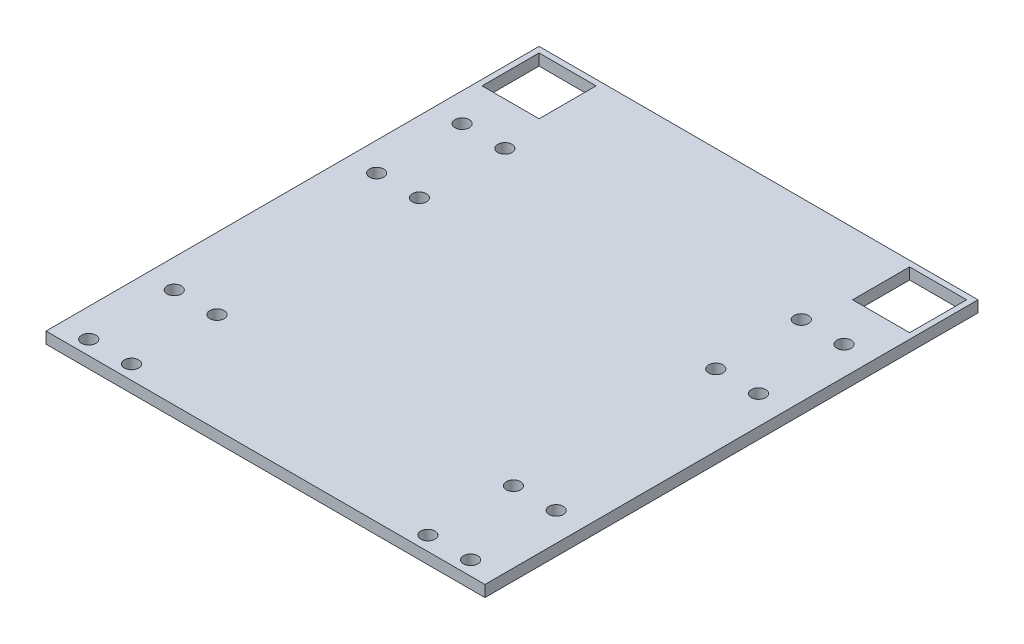
ISO-10303-21;
HEADER;
FILE_DESCRIPTION(('STEP AP214'),'2;1');
FILE_NAME('part.step','',(''),(''),'','','');
FILE_SCHEMA(('AUTOMOTIVE_DESIGN { 1 0 10303 214 1 1 1 1 }'));
ENDSEC;
DATA;
#1=APPLICATION_CONTEXT('core data for automotive mechanical design processes');
#2=APPLICATION_PROTOCOL_DEFINITION('international standard','automotive_design',2000,#1);
#3=PRODUCT_CONTEXT('',#1,'mechanical');
#4=PRODUCT('Part','Part','',(#3));
#5=PRODUCT_RELATED_PRODUCT_CATEGORY('part','',(#4));
#6=PRODUCT_DEFINITION_FORMATION('','',#4);
#7=PRODUCT_DEFINITION_CONTEXT('part definition',#1,'design');
#8=PRODUCT_DEFINITION('design','',#6,#7);
#9=PRODUCT_DEFINITION_SHAPE('','',#8);
#10=(LENGTH_UNIT() NAMED_UNIT(*) SI_UNIT(.MILLI.,.METRE.));
#11=(NAMED_UNIT(*) PLANE_ANGLE_UNIT() SI_UNIT($,.RADIAN.));
#12=(NAMED_UNIT(*) SI_UNIT($,.STERADIAN.) SOLID_ANGLE_UNIT());
#13=UNCERTAINTY_MEASURE_WITH_UNIT(LENGTH_MEASURE(1.E-05),#10,'distance_accuracy_value','');
#14=(GEOMETRIC_REPRESENTATION_CONTEXT(3) GLOBAL_UNCERTAINTY_ASSIGNED_CONTEXT((#13)) GLOBAL_UNIT_ASSIGNED_CONTEXT((#10,
#11,#12)) REPRESENTATION_CONTEXT('',''));
#15=CARTESIAN_POINT('',(0.,0.,0.));
#16=DIRECTION('',(0.,0.,1.));
#17=DIRECTION('',(1.,0.,0.));
#18=AXIS2_PLACEMENT_3D('',#15,#16,#17);
#19=CARTESIAN_POINT('',(0.,4.,0.));
#20=DIRECTION('',(-1.,0.,0.));
#21=DIRECTION('',(0.,0.,1.));
#22=AXIS2_PLACEMENT_3D('',#19,#20,#21);
#23=PLANE('',#22);
#24=DIRECTION('',(0.,0.,-1.));
#25=VECTOR('',#24,1.);
#26=CARTESIAN_POINT('',(0.,0.,0.));
#27=LINE('',#26,#25);
#28=CARTESIAN_POINT('',(0.,0.,173.));
#29=VERTEX_POINT('',#28);
#30=CARTESIAN_POINT('',(0.,0.,0.));
#31=VERTEX_POINT('',#30);
#32=EDGE_CURVE('E225',#29,#31,#27,.T.);
#33=ORIENTED_EDGE('',*,*,#32,.T.);
#34=DIRECTION('',(0.,-1.,0.));
#35=VECTOR('',#34,1.);
#36=CARTESIAN_POINT('',(0.,4.,0.));
#37=LINE('',#36,#35);
#38=CARTESIAN_POINT('',(0.,4.,0.));
#39=VERTEX_POINT('',#38);
#40=EDGE_CURVE('E11',#39,#31,#37,.T.);
#41=ORIENTED_EDGE('',*,*,#40,.F.);
#42=DIRECTION('',(0.,0.,-1.));
#43=VECTOR('',#42,1.);
#44=CARTESIAN_POINT('',(0.,4.,0.));
#45=LINE('',#44,#43);
#46=CARTESIAN_POINT('',(0.,4.,173.));
#47=VERTEX_POINT('',#46);
#48=EDGE_CURVE('E234',#47,#39,#45,.T.);
#49=ORIENTED_EDGE('',*,*,#48,.F.);
#50=DIRECTION('',(0.,-1.,0.));
#51=VECTOR('',#50,1.);
#52=CARTESIAN_POINT('',(0.,4.,173.));
#53=LINE('',#52,#51);
#54=EDGE_CURVE('E248',#47,#29,#53,.T.);
#55=ORIENTED_EDGE('',*,*,#54,.T.);
#56=EDGE_LOOP('',(#33,#41,#49,#55));
#57=FACE_BOUND('',#56,.T.);
#58=ADVANCED_FACE('F39',(#57),#23,.F.);
#59=CARTESIAN_POINT('',(0.,4.,0.));
#60=DIRECTION('',(0.,0.,1.));
#61=DIRECTION('',(1.,0.,0.));
#62=AXIS2_PLACEMENT_3D('',#59,#60,#61);
#63=PLANE('',#62);
#64=DIRECTION('',(-1.,0.,0.));
#65=VECTOR('',#64,1.);
#66=CARTESIAN_POINT('',(0.,0.,0.));
#67=LINE('',#66,#65);
#68=CARTESIAN_POINT('',(-154.,0.,0.));
#69=VERTEX_POINT('',#68);
#70=EDGE_CURVE('E252',#31,#69,#67,.T.);
#71=ORIENTED_EDGE('',*,*,#70,.T.);
#72=DIRECTION('',(0.,-1.,0.));
#73=VECTOR('',#72,1.);
#74=CARTESIAN_POINT('',(-154.,4.,0.));
#75=LINE('',#74,#73);
#76=CARTESIAN_POINT('',(-154.,4.,0.));
#77=VERTEX_POINT('',#76);
#78=EDGE_CURVE('E47',#77,#69,#75,.T.);
#79=ORIENTED_EDGE('',*,*,#78,.F.);
#80=DIRECTION('',(-1.,0.,0.));
#81=VECTOR('',#80,1.);
#82=CARTESIAN_POINT('',(0.,4.,0.));
#83=LINE('',#82,#81);
#84=EDGE_CURVE('E238',#39,#77,#83,.T.);
#85=ORIENTED_EDGE('',*,*,#84,.F.);
#86=ORIENTED_EDGE('',*,*,#40,.T.);
#87=EDGE_LOOP('',(#71,#79,#85,#86));
#88=FACE_BOUND('',#87,.T.);
#89=ADVANCED_FACE('F287',(#88),#63,.F.);
#90=CARTESIAN_POINT('',(-154.,4.,0.));
#91=DIRECTION('',(1.,0.,0.));
#92=DIRECTION('',(0.,0.,-1.));
#93=AXIS2_PLACEMENT_3D('',#90,#91,#92);
#94=PLANE('',#93);
#95=DIRECTION('',(0.,0.,1.));
#96=VECTOR('',#95,1.);
#97=CARTESIAN_POINT('',(-154.,0.,0.));
#98=LINE('',#97,#96);
#99=CARTESIAN_POINT('',(-154.,0.,173.));
#100=VERTEX_POINT('',#99);
#101=EDGE_CURVE('E255',#69,#100,#98,.T.);
#102=ORIENTED_EDGE('',*,*,#101,.T.);
#103=DIRECTION('',(0.,-1.,0.));
#104=VECTOR('',#103,1.);
#105=CARTESIAN_POINT('',(-154.,4.,173.));
#106=LINE('',#105,#104);
#107=CARTESIAN_POINT('',(-154.,4.,173.));
#108=VERTEX_POINT('',#107);
#109=EDGE_CURVE('E263',#108,#100,#106,.T.);
#110=ORIENTED_EDGE('',*,*,#109,.F.);
#111=DIRECTION('',(0.,0.,1.));
#112=VECTOR('',#111,1.);
#113=CARTESIAN_POINT('',(-154.,4.,0.));
#114=LINE('',#113,#112);
#115=EDGE_CURVE('E242',#77,#108,#114,.T.);
#116=ORIENTED_EDGE('',*,*,#115,.F.);
#117=ORIENTED_EDGE('',*,*,#78,.T.);
#118=EDGE_LOOP('',(#102,#110,#116,#117));
#119=FACE_BOUND('',#118,.T.);
#120=ADVANCED_FACE('F272',(#119),#94,.F.);
#121=CARTESIAN_POINT('',(0.,4.,173.));
#122=DIRECTION('',(0.,0.,-1.));
#123=DIRECTION('',(-1.,0.,0.));
#124=AXIS2_PLACEMENT_3D('',#121,#122,#123);
#125=PLANE('',#124);
#126=DIRECTION('',(1.,0.,0.));
#127=VECTOR('',#126,1.);
#128=CARTESIAN_POINT('',(0.,0.,173.));
#129=LINE('',#128,#127);
#130=EDGE_CURVE('E239',#100,#29,#129,.T.);
#131=ORIENTED_EDGE('',*,*,#130,.T.);
#132=ORIENTED_EDGE('',*,*,#54,.F.);
#133=DIRECTION('',(1.,0.,0.));
#134=VECTOR('',#133,1.);
#135=CARTESIAN_POINT('',(0.,4.,173.));
#136=LINE('',#135,#134);
#137=EDGE_CURVE('E245',#108,#47,#136,.T.);
#138=ORIENTED_EDGE('',*,*,#137,.F.);
#139=ORIENTED_EDGE('',*,*,#109,.T.);
#140=EDGE_LOOP('',(#131,#132,#138,#139));
#141=FACE_BOUND('',#140,.T.);
#142=ADVANCED_FACE('F280',(#141),#125,.F.);
#143=CARTESIAN_POINT('',(0.,4.,0.));
#144=DIRECTION('',(0.,-1.,0.));
#145=DIRECTION('',(0.,0.,-1.));
#146=AXIS2_PLACEMENT_3D('',#143,#144,#145);
#147=PLANE('',#146);
#148=CARTESIAN_POINT('',(-10.,4.,138.));
#149=DIRECTION('',(0.,1.,0.));
#150=DIRECTION('',(0.,0.,1.));
#151=AXIS2_PLACEMENT_3D('',#148,#149,#150);
#152=CIRCLE('',#151,2.5);
#153=CARTESIAN_POINT('',(-10.,4.,140.5));
#154=VERTEX_POINT('',#153);
#155=EDGE_CURVE('E429',#154,#154,#152,.T.);
#156=ORIENTED_EDGE('',*,*,#155,.F.);
#157=EDGE_LOOP('',(#156));
#158=FACE_BOUND('',#157,.T.);
#159=CARTESIAN_POINT('',(-25.,4.,168.));
#160=DIRECTION('',(0.,1.,0.));
#161=DIRECTION('',(0.,0.,1.));
#162=AXIS2_PLACEMENT_3D('',#159,#160,#161);
#163=CIRCLE('',#162,2.5);
#164=CARTESIAN_POINT('',(-25.,4.,170.5));
#165=VERTEX_POINT('',#164);
#166=EDGE_CURVE('E446',#165,#165,#163,.T.);
#167=ORIENTED_EDGE('',*,*,#166,.F.);
#168=EDGE_LOOP('',(#167));
#169=FACE_BOUND('',#168,.T.);
#170=CARTESIAN_POINT('',(-10.,4.,168.));
#171=DIRECTION('',(0.,1.,0.));
#172=DIRECTION('',(0.,0.,1.));
#173=AXIS2_PLACEMENT_3D('',#170,#171,#172);
#174=CIRCLE('',#173,2.5);
#175=CARTESIAN_POINT('',(-10.,4.,170.5));
#176=VERTEX_POINT('',#175);
#177=EDGE_CURVE('E445',#176,#176,#174,.T.);
#178=ORIENTED_EDGE('',*,*,#177,.F.);
#179=EDGE_LOOP('',(#178));
#180=FACE_BOUND('',#179,.T.);
#181=CARTESIAN_POINT('',(-10.,4.,37.));
#182=DIRECTION('',(0.,1.,0.));
#183=DIRECTION('',(0.,0.,-1.));
#184=AXIS2_PLACEMENT_3D('',#181,#182,#183);
#185=CIRCLE('',#184,2.5);
#186=CARTESIAN_POINT('',(-10.,4.,34.5));
#187=VERTEX_POINT('',#186);
#188=EDGE_CURVE('E462',#187,#187,#185,.T.);
#189=ORIENTED_EDGE('',*,*,#188,.F.);
#190=EDGE_LOOP('',(#189));
#191=FACE_BOUND('',#190,.T.);
#192=CARTESIAN_POINT('',(-129.,4.,168.));
#193=DIRECTION('',(0.,1.,0.));
#194=DIRECTION('',(0.,0.,-1.));
#195=AXIS2_PLACEMENT_3D('',#192,#193,#194);
#196=CIRCLE('',#195,2.5);
#197=CARTESIAN_POINT('',(-129.,4.,165.5));
#198=VERTEX_POINT('',#197);
#199=EDGE_CURVE('E406',#198,#198,#196,.T.);
#200=ORIENTED_EDGE('',*,*,#199,.F.);
#201=EDGE_LOOP('',(#200));
#202=FACE_BOUND('',#201,.T.);
#203=CARTESIAN_POINT('',(-144.,4.,138.));
#204=DIRECTION('',(0.,1.,0.));
#205=DIRECTION('',(0.,0.,-1.));
#206=AXIS2_PLACEMENT_3D('',#203,#204,#205);
#207=CIRCLE('',#206,2.5);
#208=CARTESIAN_POINT('',(-144.,4.,135.5));
#209=VERTEX_POINT('',#208);
#210=EDGE_CURVE('E414',#209,#209,#207,.T.);
#211=ORIENTED_EDGE('',*,*,#210,.F.);
#212=EDGE_LOOP('',(#211));
#213=FACE_BOUND('',#212,.T.);
#214=CARTESIAN_POINT('',(-129.,4.,138.));
#215=DIRECTION('',(0.,1.,0.));
#216=DIRECTION('',(0.,0.,-1.));
#217=AXIS2_PLACEMENT_3D('',#214,#215,#216);
#218=CIRCLE('',#217,2.49999999999997);
#219=CARTESIAN_POINT('',(-129.,4.,135.5));
#220=VERTEX_POINT('',#219);
#221=EDGE_CURVE('E413',#220,#220,#218,.T.);
#222=ORIENTED_EDGE('',*,*,#221,.F.);
#223=EDGE_LOOP('',(#222));
#224=FACE_BOUND('',#223,.T.);
#225=CARTESIAN_POINT('',(-25.,4.,138.));
#226=DIRECTION('',(0.,1.,0.));
#227=DIRECTION('',(0.,0.,1.));
#228=AXIS2_PLACEMENT_3D('',#225,#226,#227);
#229=CIRCLE('',#228,2.5);
#230=CARTESIAN_POINT('',(-25.,4.,140.5));
#231=VERTEX_POINT('',#230);
#232=EDGE_CURVE('E430',#231,#231,#229,.T.);
#233=ORIENTED_EDGE('',*,*,#232,.F.);
#234=EDGE_LOOP('',(#233));
#235=FACE_BOUND('',#234,.T.);
#236=CARTESIAN_POINT('',(-144.,4.,67.));
#237=DIRECTION('',(0.,1.,0.));
#238=DIRECTION('',(0.,0.,1.));
#239=AXIS2_PLACEMENT_3D('',#236,#237,#238);
#240=CIRCLE('',#239,2.5);
#241=CARTESIAN_POINT('',(-144.,4.,69.5));
#242=VERTEX_POINT('',#241);
#243=EDGE_CURVE('E159',#242,#242,#240,.T.);
#244=ORIENTED_EDGE('',*,*,#243,.F.);
#245=EDGE_LOOP('',(#244));
#246=FACE_BOUND('',#245,.T.);
#247=CARTESIAN_POINT('',(-129.,4.,37.));
#248=DIRECTION('',(0.,1.,0.));
#249=DIRECTION('',(0.,0.,1.));
#250=AXIS2_PLACEMENT_3D('',#247,#248,#249);
#251=CIRCLE('',#250,2.5);
#252=CARTESIAN_POINT('',(-129.,4.,39.5));
#253=VERTEX_POINT('',#252);
#254=EDGE_CURVE('E507',#253,#253,#251,.T.);
#255=ORIENTED_EDGE('',*,*,#254,.F.);
#256=EDGE_LOOP('',(#255));
#257=FACE_BOUND('',#256,.T.);
#258=CARTESIAN_POINT('',(-144.,4.,37.));
#259=DIRECTION('',(0.,1.,0.));
#260=DIRECTION('',(0.,0.,1.));
#261=AXIS2_PLACEMENT_3D('',#258,#259,#260);
#262=CIRCLE('',#261,2.5);
#263=CARTESIAN_POINT('',(-144.,4.,39.5));
#264=VERTEX_POINT('',#263);
#265=EDGE_CURVE('E186',#264,#264,#262,.T.);
#266=ORIENTED_EDGE('',*,*,#265,.F.);
#267=EDGE_LOOP('',(#266));
#268=FACE_BOUND('',#267,.T.);
#269=DIRECTION('',(0.,0.,1.));
#270=VECTOR('',#269,1.);
#271=CARTESIAN_POINT('',(-22.,4.,2.));
#272=LINE('',#271,#270);
#273=CARTESIAN_POINT('',(-22.,4.,2.));
#274=VERTEX_POINT('',#273);
#275=CARTESIAN_POINT('',(-22.,4.,22.));
#276=VERTEX_POINT('',#275);
#277=EDGE_CURVE('E168',#274,#276,#272,.T.);
#278=ORIENTED_EDGE('',*,*,#277,.F.);
#279=DIRECTION('',(-1.,0.,0.));
#280=VECTOR('',#279,1.);
#281=CARTESIAN_POINT('',(-2.,4.,2.00000000000003));
#282=LINE('',#281,#280);
#283=CARTESIAN_POINT('',(-2.,4.,2.00000000000003));
#284=VERTEX_POINT('',#283);
#285=EDGE_CURVE('E54',#284,#274,#282,.T.);
#286=ORIENTED_EDGE('',*,*,#285,.F.);
#287=DIRECTION('',(0.,0.,-1.));
#288=VECTOR('',#287,1.);
#289=CARTESIAN_POINT('',(-2.,4.,2.00000000000003));
#290=LINE('',#289,#288);
#291=CARTESIAN_POINT('',(-2.,4.,22.));
#292=VERTEX_POINT('',#291);
#293=EDGE_CURVE('E152',#292,#284,#290,.T.);
#294=ORIENTED_EDGE('',*,*,#293,.F.);
#295=DIRECTION('',(1.,0.,0.));
#296=VECTOR('',#295,1.);
#297=CARTESIAN_POINT('',(-2.,4.,22.));
#298=LINE('',#297,#296);
#299=EDGE_CURVE('E156',#276,#292,#298,.T.);
#300=ORIENTED_EDGE('',*,*,#299,.F.);
#301=EDGE_LOOP('',(#278,#286,#294,#300));
#302=FACE_BOUND('',#301,.T.);
#303=CARTESIAN_POINT('',(-25.,4.,37.));
#304=DIRECTION('',(0.,1.,0.));
#305=DIRECTION('',(0.,0.,-1.));
#306=AXIS2_PLACEMENT_3D('',#303,#304,#305);
#307=CIRCLE('',#306,2.5);
#308=CARTESIAN_POINT('',(-25.,4.,34.5));
#309=VERTEX_POINT('',#308);
#310=EDGE_CURVE('E461',#309,#309,#307,.T.);
#311=ORIENTED_EDGE('',*,*,#310,.F.);
#312=EDGE_LOOP('',(#311));
#313=FACE_BOUND('',#312,.T.);
#314=CARTESIAN_POINT('',(-9.99999999999998,4.,67.));
#315=DIRECTION('',(0.,1.,0.));
#316=DIRECTION('',(0.,0.,-1.));
#317=AXIS2_PLACEMENT_3D('',#314,#315,#316);
#318=CIRCLE('',#317,2.5);
#319=CARTESIAN_POINT('',(-9.99999999999998,4.,64.5));
#320=VERTEX_POINT('',#319);
#321=EDGE_CURVE('E478',#320,#320,#318,.T.);
#322=ORIENTED_EDGE('',*,*,#321,.F.);
#323=EDGE_LOOP('',(#322));
#324=FACE_BOUND('',#323,.T.);
#325=CARTESIAN_POINT('',(-25.,4.,67.));
#326=DIRECTION('',(0.,1.,0.));
#327=DIRECTION('',(0.,0.,-1.));
#328=AXIS2_PLACEMENT_3D('',#325,#326,#327);
#329=CIRCLE('',#328,2.5);
#330=CARTESIAN_POINT('',(-25.,4.,64.5));
#331=VERTEX_POINT('',#330);
#332=EDGE_CURVE('E477',#331,#331,#329,.T.);
#333=ORIENTED_EDGE('',*,*,#332,.F.);
#334=EDGE_LOOP('',(#333));
#335=FACE_BOUND('',#334,.T.);
#336=CARTESIAN_POINT('',(-129.,4.,67.));
#337=DIRECTION('',(0.,1.,0.));
#338=DIRECTION('',(0.,0.,1.));
#339=AXIS2_PLACEMENT_3D('',#336,#337,#338);
#340=CIRCLE('',#339,2.5);
#341=CARTESIAN_POINT('',(-129.,4.,69.5));
#342=VERTEX_POINT('',#341);
#343=EDGE_CURVE('E493',#342,#342,#340,.T.);
#344=ORIENTED_EDGE('',*,*,#343,.F.);
#345=EDGE_LOOP('',(#344));
#346=FACE_BOUND('',#345,.T.);
#347=CARTESIAN_POINT('',(-144.,4.,168.));
#348=DIRECTION('',(0.,1.,0.));
#349=DIRECTION('',(0.,0.,-1.));
#350=AXIS2_PLACEMENT_3D('',#347,#348,#349);
#351=CIRCLE('',#350,2.5);
#352=CARTESIAN_POINT('',(-144.,4.,165.5));
#353=VERTEX_POINT('',#352);
#354=EDGE_CURVE('E401',#353,#353,#351,.T.);
#355=ORIENTED_EDGE('',*,*,#354,.F.);
#356=EDGE_LOOP('',(#355));
#357=FACE_BOUND('',#356,.T.);
#358=DIRECTION('',(1.,0.,0.));
#359=VECTOR('',#358,1.);
#360=CARTESIAN_POINT('',(-152.,4.,22.));
#361=LINE('',#360,#359);
#362=CARTESIAN_POINT('',(-152.,4.,22.));
#363=VERTEX_POINT('',#362);
#364=CARTESIAN_POINT('',(-132.,4.,22.));
#365=VERTEX_POINT('',#364);
#366=EDGE_CURVE('E211',#363,#365,#361,.T.);
#367=ORIENTED_EDGE('',*,*,#366,.F.);
#368=DIRECTION('',(0.,0.,1.));
#369=VECTOR('',#368,1.);
#370=CARTESIAN_POINT('',(-152.,4.,2.00000000000002));
#371=LINE('',#370,#369);
#372=CARTESIAN_POINT('',(-152.,4.,2.00000000000002));
#373=VERTEX_POINT('',#372);
#374=EDGE_CURVE('E62',#373,#363,#371,.T.);
#375=ORIENTED_EDGE('',*,*,#374,.F.);
#376=DIRECTION('',(-1.,0.,0.));
#377=VECTOR('',#376,1.);
#378=CARTESIAN_POINT('',(-152.,4.,2.00000000000002));
#379=LINE('',#378,#377);
#380=CARTESIAN_POINT('',(-132.,4.,2.00000000000002));
#381=VERTEX_POINT('',#380);
#382=EDGE_CURVE('E196',#381,#373,#379,.T.);
#383=ORIENTED_EDGE('',*,*,#382,.F.);
#384=DIRECTION('',(0.,0.,-1.));
#385=VECTOR('',#384,1.);
#386=CARTESIAN_POINT('',(-132.,4.,2.00000000000002));
#387=LINE('',#386,#385);
#388=EDGE_CURVE('E215',#365,#381,#387,.T.);
#389=ORIENTED_EDGE('',*,*,#388,.F.);
#390=EDGE_LOOP('',(#367,#375,#383,#389));
#391=FACE_BOUND('',#390,.T.);
#392=ORIENTED_EDGE('',*,*,#48,.T.);
#393=ORIENTED_EDGE('',*,*,#84,.T.);
#394=ORIENTED_EDGE('',*,*,#115,.T.);
#395=ORIENTED_EDGE('',*,*,#137,.T.);
#396=EDGE_LOOP('',(#392,#393,#394,#395));
#397=FACE_BOUND('',#396,.T.);
#398=ADVANCED_FACE('F286',(#158,#169,#180,#191,#202,#213,#224,#235,#246,#257,#268,#302,#313,
#324,#335,#346,#357,#391,#397),#147,.F.);
#399=CARTESIAN_POINT('',(0.,0.,0.));
#400=DIRECTION('',(0.,-1.,0.));
#401=DIRECTION('',(0.,0.,-1.));
#402=AXIS2_PLACEMENT_3D('',#399,#400,#401);
#403=PLANE('',#402);
#404=CARTESIAN_POINT('',(-10.,0.,138.));
#405=DIRECTION('',(0.,1.,0.));
#406=DIRECTION('',(0.,0.,1.));
#407=AXIS2_PLACEMENT_3D('',#404,#405,#406);
#408=CIRCLE('',#407,2.5);
#409=CARTESIAN_POINT('',(-10.,0.,140.5));
#410=VERTEX_POINT('',#409);
#411=EDGE_CURVE('E450',#410,#410,#408,.T.);
#412=ORIENTED_EDGE('',*,*,#411,.T.);
#413=EDGE_LOOP('',(#412));
#414=FACE_BOUND('',#413,.T.);
#415=CARTESIAN_POINT('',(-25.,0.,168.));
#416=DIRECTION('',(0.,1.,0.));
#417=DIRECTION('',(0.,0.,1.));
#418=AXIS2_PLACEMENT_3D('',#415,#416,#417);
#419=CIRCLE('',#418,2.5);
#420=CARTESIAN_POINT('',(-25.,0.,170.5));
#421=VERTEX_POINT('',#420);
#422=EDGE_CURVE('E441',#421,#421,#419,.T.);
#423=ORIENTED_EDGE('',*,*,#422,.T.);
#424=EDGE_LOOP('',(#423));
#425=FACE_BOUND('',#424,.T.);
#426=CARTESIAN_POINT('',(-10.,0.,168.));
#427=DIRECTION('',(0.,1.,0.));
#428=DIRECTION('',(0.,0.,1.));
#429=AXIS2_PLACEMENT_3D('',#426,#427,#428);
#430=CIRCLE('',#429,2.5);
#431=CARTESIAN_POINT('',(-10.,0.,170.5));
#432=VERTEX_POINT('',#431);
#433=EDGE_CURVE('E466',#432,#432,#430,.T.);
#434=ORIENTED_EDGE('',*,*,#433,.T.);
#435=EDGE_LOOP('',(#434));
#436=FACE_BOUND('',#435,.T.);
#437=CARTESIAN_POINT('',(-10.,0.,37.));
#438=DIRECTION('',(0.,1.,0.));
#439=DIRECTION('',(0.,0.,-1.));
#440=AXIS2_PLACEMENT_3D('',#437,#438,#439);
#441=CIRCLE('',#440,2.5);
#442=CARTESIAN_POINT('',(-10.,0.,34.5));
#443=VERTEX_POINT('',#442);
#444=EDGE_CURVE('E457',#443,#443,#441,.T.);
#445=ORIENTED_EDGE('',*,*,#444,.T.);
#446=EDGE_LOOP('',(#445));
#447=FACE_BOUND('',#446,.T.);
#448=CARTESIAN_POINT('',(-129.,0.,168.));
#449=DIRECTION('',(0.,1.,0.));
#450=DIRECTION('',(0.,0.,-1.));
#451=AXIS2_PLACEMENT_3D('',#448,#449,#450);
#452=CIRCLE('',#451,2.5);
#453=CARTESIAN_POINT('',(-129.,0.,165.5));
#454=VERTEX_POINT('',#453);
#455=EDGE_CURVE('E418',#454,#454,#452,.T.);
#456=ORIENTED_EDGE('',*,*,#455,.T.);
#457=EDGE_LOOP('',(#456));
#458=FACE_BOUND('',#457,.T.);
#459=CARTESIAN_POINT('',(-144.,0.,138.));
#460=DIRECTION('',(0.,1.,0.));
#461=DIRECTION('',(0.,0.,-1.));
#462=AXIS2_PLACEMENT_3D('',#459,#460,#461);
#463=CIRCLE('',#462,2.5);
#464=CARTESIAN_POINT('',(-144.,0.,135.5));
#465=VERTEX_POINT('',#464);
#466=EDGE_CURVE('E409',#465,#465,#463,.T.);
#467=ORIENTED_EDGE('',*,*,#466,.T.);
#468=EDGE_LOOP('',(#467));
#469=FACE_BOUND('',#468,.T.);
#470=CARTESIAN_POINT('',(-129.,0.,138.));
#471=DIRECTION('',(0.,1.,0.));
#472=DIRECTION('',(0.,0.,-1.));
#473=AXIS2_PLACEMENT_3D('',#470,#471,#472);
#474=CIRCLE('',#473,2.49999999999997);
#475=CARTESIAN_POINT('',(-129.,0.,135.5));
#476=VERTEX_POINT('',#475);
#477=EDGE_CURVE('E434',#476,#476,#474,.T.);
#478=ORIENTED_EDGE('',*,*,#477,.T.);
#479=EDGE_LOOP('',(#478));
#480=FACE_BOUND('',#479,.T.);
#481=CARTESIAN_POINT('',(-25.,0.,138.));
#482=DIRECTION('',(0.,1.,0.));
#483=DIRECTION('',(0.,0.,1.));
#484=AXIS2_PLACEMENT_3D('',#481,#482,#483);
#485=CIRCLE('',#484,2.5);
#486=CARTESIAN_POINT('',(-25.,0.,140.5));
#487=VERTEX_POINT('',#486);
#488=EDGE_CURVE('E425',#487,#487,#485,.T.);
#489=ORIENTED_EDGE('',*,*,#488,.T.);
#490=EDGE_LOOP('',(#489));
#491=FACE_BOUND('',#490,.T.);
#492=CARTESIAN_POINT('',(-144.,0.,67.));
#493=DIRECTION('',(0.,1.,0.));
#494=DIRECTION('',(0.,0.,1.));
#495=AXIS2_PLACEMENT_3D('',#492,#493,#494);
#496=CIRCLE('',#495,2.5);
#497=CARTESIAN_POINT('',(-144.,0.,69.5));
#498=VERTEX_POINT('',#497);
#499=EDGE_CURVE('E510',#498,#498,#496,.T.);
#500=ORIENTED_EDGE('',*,*,#499,.T.);
#501=EDGE_LOOP('',(#500));
#502=FACE_BOUND('',#501,.T.);
#503=CARTESIAN_POINT('',(-129.,0.,37.));
#504=DIRECTION('',(0.,1.,0.));
#505=DIRECTION('',(0.,0.,1.));
#506=AXIS2_PLACEMENT_3D('',#503,#504,#505);
#507=CIRCLE('',#506,2.5);
#508=CARTESIAN_POINT('',(-129.,0.,39.5));
#509=VERTEX_POINT('',#508);
#510=EDGE_CURVE('E190',#509,#509,#507,.T.);
#511=ORIENTED_EDGE('',*,*,#510,.T.);
#512=EDGE_LOOP('',(#511));
#513=FACE_BOUND('',#512,.T.);
#514=CARTESIAN_POINT('',(-144.,0.,37.));
#515=DIRECTION('',(0.,1.,0.));
#516=DIRECTION('',(0.,0.,1.));
#517=AXIS2_PLACEMENT_3D('',#514,#515,#516);
#518=CIRCLE('',#517,2.5);
#519=CARTESIAN_POINT('',(-144.,0.,39.5));
#520=VERTEX_POINT('',#519);
#521=EDGE_CURVE('E169',#520,#520,#518,.T.);
#522=ORIENTED_EDGE('',*,*,#521,.T.);
#523=EDGE_LOOP('',(#522));
#524=FACE_BOUND('',#523,.T.);
#525=DIRECTION('',(-1.,0.,0.));
#526=VECTOR('',#525,1.);
#527=CARTESIAN_POINT('',(-2.,0.,2.00000000000003));
#528=LINE('',#527,#526);
#529=CARTESIAN_POINT('',(-2.,0.,2.00000000000003));
#530=VERTEX_POINT('',#529);
#531=CARTESIAN_POINT('',(-22.,0.,2.));
#532=VERTEX_POINT('',#531);
#533=EDGE_CURVE('E130',#530,#532,#528,.T.);
#534=ORIENTED_EDGE('',*,*,#533,.T.);
#535=DIRECTION('',(0.,0.,1.));
#536=VECTOR('',#535,1.);
#537=CARTESIAN_POINT('',(-22.,0.,2.));
#538=LINE('',#537,#536);
#539=CARTESIAN_POINT('',(-22.,0.,22.));
#540=VERTEX_POINT('',#539);
#541=EDGE_CURVE('E141',#532,#540,#538,.T.);
#542=ORIENTED_EDGE('',*,*,#541,.T.);
#543=DIRECTION('',(1.,0.,0.));
#544=VECTOR('',#543,1.);
#545=CARTESIAN_POINT('',(-2.,0.,22.));
#546=LINE('',#545,#544);
#547=CARTESIAN_POINT('',(-2.,0.,22.));
#548=VERTEX_POINT('',#547);
#549=EDGE_CURVE('E146',#540,#548,#546,.T.);
#550=ORIENTED_EDGE('',*,*,#549,.T.);
#551=DIRECTION('',(0.,0.,-1.));
#552=VECTOR('',#551,1.);
#553=CARTESIAN_POINT('',(-2.,0.,2.00000000000003));
#554=LINE('',#553,#552);
#555=EDGE_CURVE('E137',#548,#530,#554,.T.);
#556=ORIENTED_EDGE('',*,*,#555,.T.);
#557=EDGE_LOOP('',(#534,#542,#550,#556));
#558=FACE_BOUND('',#557,.T.);
#559=CARTESIAN_POINT('',(-25.,0.,37.));
#560=DIRECTION('',(0.,1.,0.));
#561=DIRECTION('',(0.,0.,-1.));
#562=AXIS2_PLACEMENT_3D('',#559,#560,#561);
#563=CIRCLE('',#562,2.5);
#564=CARTESIAN_POINT('',(-25.,0.,34.5));
#565=VERTEX_POINT('',#564);
#566=EDGE_CURVE('E482',#565,#565,#563,.T.);
#567=ORIENTED_EDGE('',*,*,#566,.T.);
#568=EDGE_LOOP('',(#567));
#569=FACE_BOUND('',#568,.T.);
#570=CARTESIAN_POINT('',(-9.99999999999998,0.,67.));
#571=DIRECTION('',(0.,1.,0.));
#572=DIRECTION('',(0.,0.,-1.));
#573=AXIS2_PLACEMENT_3D('',#570,#571,#572);
#574=CIRCLE('',#573,2.5);
#575=CARTESIAN_POINT('',(-9.99999999999998,0.,64.5));
#576=VERTEX_POINT('',#575);
#577=EDGE_CURVE('E473',#576,#576,#574,.T.);
#578=ORIENTED_EDGE('',*,*,#577,.T.);
#579=EDGE_LOOP('',(#578));
#580=FACE_BOUND('',#579,.T.);
#581=CARTESIAN_POINT('',(-25.,0.,67.));
#582=DIRECTION('',(0.,1.,0.));
#583=DIRECTION('',(0.,0.,-1.));
#584=AXIS2_PLACEMENT_3D('',#581,#582,#583);
#585=CIRCLE('',#584,2.5);
#586=CARTESIAN_POINT('',(-25.,0.,64.5));
#587=VERTEX_POINT('',#586);
#588=EDGE_CURVE('E497',#587,#587,#585,.T.);
#589=ORIENTED_EDGE('',*,*,#588,.T.);
#590=EDGE_LOOP('',(#589));
#591=FACE_BOUND('',#590,.T.);
#592=CARTESIAN_POINT('',(-129.,0.,67.));
#593=DIRECTION('',(0.,1.,0.));
#594=DIRECTION('',(0.,0.,1.));
#595=AXIS2_PLACEMENT_3D('',#592,#593,#594);
#596=CIRCLE('',#595,2.5);
#597=CARTESIAN_POINT('',(-129.,0.,69.5));
#598=VERTEX_POINT('',#597);
#599=EDGE_CURVE('E489',#598,#598,#596,.T.);
#600=ORIENTED_EDGE('',*,*,#599,.T.);
#601=EDGE_LOOP('',(#600));
#602=FACE_BOUND('',#601,.T.);
#603=CARTESIAN_POINT('',(-144.,0.,168.));
#604=DIRECTION('',(0.,1.,0.));
#605=DIRECTION('',(0.,0.,-1.));
#606=AXIS2_PLACEMENT_3D('',#603,#604,#605);
#607=CIRCLE('',#606,2.5);
#608=CARTESIAN_POINT('',(-144.,0.,165.5));
#609=VERTEX_POINT('',#608);
#610=EDGE_CURVE('E398',#609,#609,#607,.T.);
#611=ORIENTED_EDGE('',*,*,#610,.T.);
#612=EDGE_LOOP('',(#611));
#613=FACE_BOUND('',#612,.T.);
#614=DIRECTION('',(0.,0.,1.));
#615=VECTOR('',#614,1.);
#616=CARTESIAN_POINT('',(-152.,0.,2.00000000000002));
#617=LINE('',#616,#615);
#618=CARTESIAN_POINT('',(-152.,0.,2.00000000000002));
#619=VERTEX_POINT('',#618);
#620=CARTESIAN_POINT('',(-152.,0.,22.));
#621=VERTEX_POINT('',#620);
#622=EDGE_CURVE('E191',#619,#621,#617,.T.);
#623=ORIENTED_EDGE('',*,*,#622,.T.);
#624=DIRECTION('',(1.,0.,0.));
#625=VECTOR('',#624,1.);
#626=CARTESIAN_POINT('',(-152.,0.,22.));
#627=LINE('',#626,#625);
#628=CARTESIAN_POINT('',(-132.,0.,22.));
#629=VERTEX_POINT('',#628);
#630=EDGE_CURVE('E195',#621,#629,#627,.T.);
#631=ORIENTED_EDGE('',*,*,#630,.T.);
#632=DIRECTION('',(0.,0.,-1.));
#633=VECTOR('',#632,1.);
#634=CARTESIAN_POINT('',(-132.,0.,2.00000000000002));
#635=LINE('',#634,#633);
#636=CARTESIAN_POINT('',(-132.,0.,2.00000000000002));
#637=VERTEX_POINT('',#636);
#638=EDGE_CURVE('E200',#629,#637,#635,.T.);
#639=ORIENTED_EDGE('',*,*,#638,.T.);
#640=DIRECTION('',(-1.,0.,0.));
#641=VECTOR('',#640,1.);
#642=CARTESIAN_POINT('',(-152.,0.,2.00000000000002));
#643=LINE('',#642,#641);
#644=EDGE_CURVE('E204',#637,#619,#643,.T.);
#645=ORIENTED_EDGE('',*,*,#644,.T.);
#646=EDGE_LOOP('',(#623,#631,#639,#645));
#647=FACE_BOUND('',#646,.T.);
#648=ORIENTED_EDGE('',*,*,#32,.F.);
#649=ORIENTED_EDGE('',*,*,#130,.F.);
#650=ORIENTED_EDGE('',*,*,#101,.F.);
#651=ORIENTED_EDGE('',*,*,#70,.F.);
#652=EDGE_LOOP('',(#648,#649,#650,#651));
#653=FACE_BOUND('',#652,.T.);
#654=ADVANCED_FACE('F148',(#414,#425,#436,#447,#458,#469,#480,#491,#502,#513,#524,#558,#569,
#580,#591,#602,#613,#647,#653),#403,.T.);
#655=CARTESIAN_POINT('',(-152.,0.,2.00000000000002));
#656=DIRECTION('',(-1.,0.,0.));
#657=DIRECTION('',(0.,0.,1.));
#658=AXIS2_PLACEMENT_3D('',#655,#656,#657);
#659=PLANE('',#658);
#660=ORIENTED_EDGE('',*,*,#374,.T.);
#661=DIRECTION('',(0.,1.,0.));
#662=VECTOR('',#661,1.);
#663=CARTESIAN_POINT('',(-152.,0.,22.));
#664=LINE('',#663,#662);
#665=EDGE_CURVE('E208',#621,#363,#664,.T.);
#666=ORIENTED_EDGE('',*,*,#665,.F.);
#667=ORIENTED_EDGE('',*,*,#622,.F.);
#668=DIRECTION('',(0.,1.,0.));
#669=VECTOR('',#668,1.);
#670=CARTESIAN_POINT('',(-152.,0.,2.00000000000002));
#671=LINE('',#670,#669);
#672=EDGE_CURVE('E222',#619,#373,#671,.T.);
#673=ORIENTED_EDGE('',*,*,#672,.T.);
#674=EDGE_LOOP('',(#660,#666,#667,#673));
#675=FACE_BOUND('',#674,.T.);
#676=ADVANCED_FACE('F299',(#675),#659,.F.);
#677=CARTESIAN_POINT('',(-152.,0.,2.00000000000002));
#678=DIRECTION('',(0.,0.,-1.));
#679=DIRECTION('',(-1.,0.,0.));
#680=AXIS2_PLACEMENT_3D('',#677,#678,#679);
#681=PLANE('',#680);
#682=ORIENTED_EDGE('',*,*,#382,.T.);
#683=ORIENTED_EDGE('',*,*,#672,.F.);
#684=ORIENTED_EDGE('',*,*,#644,.F.);
#685=DIRECTION('',(0.,1.,0.));
#686=VECTOR('',#685,1.);
#687=CARTESIAN_POINT('',(-132.,0.,2.00000000000002));
#688=LINE('',#687,#686);
#689=EDGE_CURVE('E226',#637,#381,#688,.T.);
#690=ORIENTED_EDGE('',*,*,#689,.T.);
#691=EDGE_LOOP('',(#682,#683,#684,#690));
#692=FACE_BOUND('',#691,.T.);
#693=ADVANCED_FACE('F306',(#692),#681,.F.);
#694=CARTESIAN_POINT('',(-132.,0.,2.00000000000002));
#695=DIRECTION('',(1.,0.,0.));
#696=DIRECTION('',(0.,0.,-1.));
#697=AXIS2_PLACEMENT_3D('',#694,#695,#696);
#698=PLANE('',#697);
#699=ORIENTED_EDGE('',*,*,#388,.T.);
#700=ORIENTED_EDGE('',*,*,#689,.F.);
#701=ORIENTED_EDGE('',*,*,#638,.F.);
#702=DIRECTION('',(0.,1.,0.));
#703=VECTOR('',#702,1.);
#704=CARTESIAN_POINT('',(-132.,0.,22.));
#705=LINE('',#704,#703);
#706=EDGE_CURVE('E229',#629,#365,#705,.T.);
#707=ORIENTED_EDGE('',*,*,#706,.T.);
#708=EDGE_LOOP('',(#699,#700,#701,#707));
#709=FACE_BOUND('',#708,.T.);
#710=ADVANCED_FACE('F311',(#709),#698,.F.);
#711=CARTESIAN_POINT('',(-152.,0.,22.));
#712=DIRECTION('',(0.,0.,1.));
#713=DIRECTION('',(1.,0.,0.));
#714=AXIS2_PLACEMENT_3D('',#711,#712,#713);
#715=PLANE('',#714);
#716=ORIENTED_EDGE('',*,*,#366,.T.);
#717=ORIENTED_EDGE('',*,*,#706,.F.);
#718=ORIENTED_EDGE('',*,*,#630,.F.);
#719=ORIENTED_EDGE('',*,*,#665,.T.);
#720=EDGE_LOOP('',(#716,#717,#718,#719));
#721=FACE_BOUND('',#720,.T.);
#722=ADVANCED_FACE('F307',(#721),#715,.F.);
#723=CARTESIAN_POINT('',(-144.,0.,168.));
#724=DIRECTION('',(0.,1.,0.));
#725=DIRECTION('',(0.,0.,1.));
#726=AXIS2_PLACEMENT_3D('',#723,#724,#725);
#727=CYLINDRICAL_SURFACE('',#726,2.5);
#728=ORIENTED_EDGE('',*,*,#610,.F.);
#729=EDGE_LOOP('',(#728));
#730=FACE_BOUND('',#729,.T.);
#731=ORIENTED_EDGE('',*,*,#354,.T.);
#732=EDGE_LOOP('',(#731));
#733=FACE_BOUND('',#732,.T.);
#734=ADVANCED_FACE('F310',(#730,#733),#727,.F.);
#735=CARTESIAN_POINT('',(-129.,0.,67.));
#736=DIRECTION('',(0.,1.,0.));
#737=DIRECTION('',(0.,0.,1.));
#738=AXIS2_PLACEMENT_3D('',#735,#736,#737);
#739=CYLINDRICAL_SURFACE('',#738,2.5);
#740=ORIENTED_EDGE('',*,*,#599,.F.);
#741=EDGE_LOOP('',(#740));
#742=FACE_BOUND('',#741,.T.);
#743=ORIENTED_EDGE('',*,*,#343,.T.);
#744=EDGE_LOOP('',(#743));
#745=FACE_BOUND('',#744,.T.);
#746=ADVANCED_FACE('F349',(#742,#745),#739,.F.);
#747=CARTESIAN_POINT('',(-25.,0.,67.));
#748=DIRECTION('',(0.,1.,0.));
#749=DIRECTION('',(0.,0.,1.));
#750=AXIS2_PLACEMENT_3D('',#747,#748,#749);
#751=CYLINDRICAL_SURFACE('',#750,2.5);
#752=ORIENTED_EDGE('',*,*,#588,.F.);
#753=EDGE_LOOP('',(#752));
#754=FACE_BOUND('',#753,.T.);
#755=ORIENTED_EDGE('',*,*,#332,.T.);
#756=EDGE_LOOP('',(#755));
#757=FACE_BOUND('',#756,.T.);
#758=ADVANCED_FACE('F345',(#754,#757),#751,.F.);
#759=CARTESIAN_POINT('',(-9.99999999999998,0.,67.));
#760=DIRECTION('',(0.,1.,0.));
#761=DIRECTION('',(0.,0.,1.));
#762=AXIS2_PLACEMENT_3D('',#759,#760,#761);
#763=CYLINDRICAL_SURFACE('',#762,2.5);
#764=ORIENTED_EDGE('',*,*,#577,.F.);
#765=EDGE_LOOP('',(#764));
#766=FACE_BOUND('',#765,.T.);
#767=ORIENTED_EDGE('',*,*,#321,.T.);
#768=EDGE_LOOP('',(#767));
#769=FACE_BOUND('',#768,.T.);
#770=ADVANCED_FACE('F348',(#766,#769),#763,.F.);
#771=CARTESIAN_POINT('',(-25.,0.,37.));
#772=DIRECTION('',(0.,1.,0.));
#773=DIRECTION('',(0.,0.,1.));
#774=AXIS2_PLACEMENT_3D('',#771,#772,#773);
#775=CYLINDRICAL_SURFACE('',#774,2.5);
#776=ORIENTED_EDGE('',*,*,#566,.F.);
#777=EDGE_LOOP('',(#776));
#778=FACE_BOUND('',#777,.T.);
#779=ORIENTED_EDGE('',*,*,#310,.T.);
#780=EDGE_LOOP('',(#779));
#781=FACE_BOUND('',#780,.T.);
#782=ADVANCED_FACE('F327',(#778,#781),#775,.F.);
#783=CARTESIAN_POINT('',(-2.,0.,2.00000000000003));
#784=DIRECTION('',(0.,0.,-1.));
#785=DIRECTION('',(-1.,0.,0.));
#786=AXIS2_PLACEMENT_3D('',#783,#784,#785);
#787=PLANE('',#786);
#788=ORIENTED_EDGE('',*,*,#285,.T.);
#789=DIRECTION('',(0.,1.,0.));
#790=VECTOR('',#789,1.);
#791=CARTESIAN_POINT('',(-22.,0.,2.));
#792=LINE('',#791,#790);
#793=EDGE_CURVE('E126',#532,#274,#792,.T.);
#794=ORIENTED_EDGE('',*,*,#793,.F.);
#795=ORIENTED_EDGE('',*,*,#533,.F.);
#796=DIRECTION('',(0.,1.,0.));
#797=VECTOR('',#796,1.);
#798=CARTESIAN_POINT('',(-2.,0.,2.00000000000003));
#799=LINE('',#798,#797);
#800=EDGE_CURVE('E175',#530,#284,#799,.T.);
#801=ORIENTED_EDGE('',*,*,#800,.T.);
#802=EDGE_LOOP('',(#788,#794,#795,#801));
#803=FACE_BOUND('',#802,.T.);
#804=ADVANCED_FACE('F128',(#803),#787,.F.);
#805=CARTESIAN_POINT('',(-2.,0.,2.00000000000003));
#806=DIRECTION('',(1.,0.,0.));
#807=DIRECTION('',(0.,0.,-1.));
#808=AXIS2_PLACEMENT_3D('',#805,#806,#807);
#809=PLANE('',#808);
#810=ORIENTED_EDGE('',*,*,#293,.T.);
#811=ORIENTED_EDGE('',*,*,#800,.F.);
#812=ORIENTED_EDGE('',*,*,#555,.F.);
#813=DIRECTION('',(0.,1.,0.));
#814=VECTOR('',#813,1.);
#815=CARTESIAN_POINT('',(-2.,0.,22.));
#816=LINE('',#815,#814);
#817=EDGE_CURVE('E178',#548,#292,#816,.T.);
#818=ORIENTED_EDGE('',*,*,#817,.T.);
#819=EDGE_LOOP('',(#810,#811,#812,#818));
#820=FACE_BOUND('',#819,.T.);
#821=ADVANCED_FACE('F326',(#820),#809,.F.);
#822=CARTESIAN_POINT('',(-2.,0.,22.));
#823=DIRECTION('',(0.,0.,1.));
#824=DIRECTION('',(1.,0.,0.));
#825=AXIS2_PLACEMENT_3D('',#822,#823,#824);
#826=PLANE('',#825);
#827=ORIENTED_EDGE('',*,*,#299,.T.);
#828=ORIENTED_EDGE('',*,*,#817,.F.);
#829=ORIENTED_EDGE('',*,*,#549,.F.);
#830=DIRECTION('',(0.,1.,0.));
#831=VECTOR('',#830,1.);
#832=CARTESIAN_POINT('',(-22.,0.,22.));
#833=LINE('',#832,#831);
#834=EDGE_CURVE('E136',#540,#276,#833,.T.);
#835=ORIENTED_EDGE('',*,*,#834,.T.);
#836=EDGE_LOOP('',(#827,#828,#829,#835));
#837=FACE_BOUND('',#836,.T.);
#838=ADVANCED_FACE('F330',(#837),#826,.F.);
#839=CARTESIAN_POINT('',(-22.,0.,2.));
#840=DIRECTION('',(-1.,0.,0.));
#841=DIRECTION('',(0.,0.,1.));
#842=AXIS2_PLACEMENT_3D('',#839,#840,#841);
#843=PLANE('',#842);
#844=ORIENTED_EDGE('',*,*,#277,.T.);
#845=ORIENTED_EDGE('',*,*,#834,.F.);
#846=ORIENTED_EDGE('',*,*,#541,.F.);
#847=ORIENTED_EDGE('',*,*,#793,.T.);
#848=EDGE_LOOP('',(#844,#845,#846,#847));
#849=FACE_BOUND('',#848,.T.);
#850=ADVANCED_FACE('F142',(#849),#843,.F.);
#851=CARTESIAN_POINT('',(-144.,0.,37.));
#852=DIRECTION('',(0.,1.,0.));
#853=DIRECTION('',(0.,0.,1.));
#854=AXIS2_PLACEMENT_3D('',#851,#852,#853);
#855=CYLINDRICAL_SURFACE('',#854,2.5);
#856=ORIENTED_EDGE('',*,*,#521,.F.);
#857=EDGE_LOOP('',(#856));
#858=FACE_BOUND('',#857,.T.);
#859=ORIENTED_EDGE('',*,*,#265,.T.);
#860=EDGE_LOOP('',(#859));
#861=FACE_BOUND('',#860,.T.);
#862=ADVANCED_FACE('F319',(#858,#861),#855,.F.);
#863=CARTESIAN_POINT('',(-129.,0.,37.));
#864=DIRECTION('',(0.,1.,0.));
#865=DIRECTION('',(0.,0.,1.));
#866=AXIS2_PLACEMENT_3D('',#863,#864,#865);
#867=CYLINDRICAL_SURFACE('',#866,2.5);
#868=ORIENTED_EDGE('',*,*,#510,.F.);
#869=EDGE_LOOP('',(#868));
#870=FACE_BOUND('',#869,.T.);
#871=ORIENTED_EDGE('',*,*,#254,.T.);
#872=EDGE_LOOP('',(#871));
#873=FACE_BOUND('',#872,.T.);
#874=ADVANCED_FACE('F322',(#870,#873),#867,.F.);
#875=CARTESIAN_POINT('',(-144.,0.,67.));
#876=DIRECTION('',(0.,1.,0.));
#877=DIRECTION('',(0.,0.,1.));
#878=AXIS2_PLACEMENT_3D('',#875,#876,#877);
#879=CYLINDRICAL_SURFACE('',#878,2.5);
#880=ORIENTED_EDGE('',*,*,#499,.F.);
#881=EDGE_LOOP('',(#880));
#882=FACE_BOUND('',#881,.T.);
#883=ORIENTED_EDGE('',*,*,#243,.T.);
#884=EDGE_LOOP('',(#883));
#885=FACE_BOUND('',#884,.T.);
#886=ADVANCED_FACE('F337',(#882,#885),#879,.F.);
#887=CARTESIAN_POINT('',(-25.,0.,138.));
#888=DIRECTION('',(0.,1.,0.));
#889=DIRECTION('',(0.,0.,1.));
#890=AXIS2_PLACEMENT_3D('',#887,#888,#889);
#891=CYLINDRICAL_SURFACE('',#890,2.5);
#892=ORIENTED_EDGE('',*,*,#488,.F.);
#893=EDGE_LOOP('',(#892));
#894=FACE_BOUND('',#893,.T.);
#895=ORIENTED_EDGE('',*,*,#232,.T.);
#896=EDGE_LOOP('',(#895));
#897=FACE_BOUND('',#896,.T.);
#898=ADVANCED_FACE('F340',(#894,#897),#891,.F.);
#899=CARTESIAN_POINT('',(-129.,0.,138.));
#900=DIRECTION('',(0.,1.,0.));
#901=DIRECTION('',(0.,0.,1.));
#902=AXIS2_PLACEMENT_3D('',#899,#900,#901);
#903=CYLINDRICAL_SURFACE('',#902,2.49999999999997);
#904=ORIENTED_EDGE('',*,*,#477,.F.);
#905=EDGE_LOOP('',(#904));
#906=FACE_BOUND('',#905,.T.);
#907=ORIENTED_EDGE('',*,*,#221,.T.);
#908=EDGE_LOOP('',(#907));
#909=FACE_BOUND('',#908,.T.);
#910=ADVANCED_FACE('F377',(#906,#909),#903,.F.);
#911=CARTESIAN_POINT('',(-144.,0.,138.));
#912=DIRECTION('',(0.,1.,0.));
#913=DIRECTION('',(0.,0.,1.));
#914=AXIS2_PLACEMENT_3D('',#911,#912,#913);
#915=CYLINDRICAL_SURFACE('',#914,2.5);
#916=ORIENTED_EDGE('',*,*,#466,.F.);
#917=EDGE_LOOP('',(#916));
#918=FACE_BOUND('',#917,.T.);
#919=ORIENTED_EDGE('',*,*,#210,.T.);
#920=EDGE_LOOP('',(#919));
#921=FACE_BOUND('',#920,.T.);
#922=ADVANCED_FACE('F380',(#918,#921),#915,.F.);
#923=CARTESIAN_POINT('',(-129.,0.,168.));
#924=DIRECTION('',(0.,1.,0.));
#925=DIRECTION('',(0.,0.,1.));
#926=AXIS2_PLACEMENT_3D('',#923,#924,#925);
#927=CYLINDRICAL_SURFACE('',#926,2.5);
#928=ORIENTED_EDGE('',*,*,#455,.F.);
#929=EDGE_LOOP('',(#928));
#930=FACE_BOUND('',#929,.T.);
#931=ORIENTED_EDGE('',*,*,#199,.T.);
#932=EDGE_LOOP('',(#931));
#933=FACE_BOUND('',#932,.T.);
#934=ADVANCED_FACE('F368',(#930,#933),#927,.F.);
#935=CARTESIAN_POINT('',(-10.,0.,37.));
#936=DIRECTION('',(0.,1.,0.));
#937=DIRECTION('',(0.,0.,1.));
#938=AXIS2_PLACEMENT_3D('',#935,#936,#937);
#939=CYLINDRICAL_SURFACE('',#938,2.5);
#940=ORIENTED_EDGE('',*,*,#444,.F.);
#941=EDGE_LOOP('',(#940));
#942=FACE_BOUND('',#941,.T.);
#943=ORIENTED_EDGE('',*,*,#188,.T.);
#944=EDGE_LOOP('',(#943));
#945=FACE_BOUND('',#944,.T.);
#946=ADVANCED_FACE('F364',(#942,#945),#939,.F.);
#947=CARTESIAN_POINT('',(-10.,0.,168.));
#948=DIRECTION('',(0.,1.,0.));
#949=DIRECTION('',(0.,0.,1.));
#950=AXIS2_PLACEMENT_3D('',#947,#948,#949);
#951=CYLINDRICAL_SURFACE('',#950,2.5);
#952=ORIENTED_EDGE('',*,*,#433,.F.);
#953=EDGE_LOOP('',(#952));
#954=FACE_BOUND('',#953,.T.);
#955=ORIENTED_EDGE('',*,*,#177,.T.);
#956=EDGE_LOOP('',(#955));
#957=FACE_BOUND('',#956,.T.);
#958=ADVANCED_FACE('F360',(#954,#957),#951,.F.);
#959=CARTESIAN_POINT('',(-25.,0.,168.));
#960=DIRECTION('',(0.,1.,0.));
#961=DIRECTION('',(0.,0.,1.));
#962=AXIS2_PLACEMENT_3D('',#959,#960,#961);
#963=CYLINDRICAL_SURFACE('',#962,2.5);
#964=ORIENTED_EDGE('',*,*,#422,.F.);
#965=EDGE_LOOP('',(#964));
#966=FACE_BOUND('',#965,.T.);
#967=ORIENTED_EDGE('',*,*,#166,.T.);
#968=EDGE_LOOP('',(#967));
#969=FACE_BOUND('',#968,.T.);
#970=ADVANCED_FACE('F363',(#966,#969),#963,.F.);
#971=CARTESIAN_POINT('',(-10.,0.,138.));
#972=DIRECTION('',(0.,1.,0.));
#973=DIRECTION('',(0.,0.,1.));
#974=AXIS2_PLACEMENT_3D('',#971,#972,#973);
#975=CYLINDRICAL_SURFACE('',#974,2.5);
#976=ORIENTED_EDGE('',*,*,#411,.F.);
#977=EDGE_LOOP('',(#976));
#978=FACE_BOUND('',#977,.T.);
#979=ORIENTED_EDGE('',*,*,#155,.T.);
#980=EDGE_LOOP('',(#979));
#981=FACE_BOUND('',#980,.T.);
#982=ADVANCED_FACE('F370',(#978,#981),#975,.F.);
#983=CLOSED_SHELL('',(#58,#89,#120,#142,#398,#654,#676,#693,#710,#722,#734,#746,#758,#770,#782,
#804,#821,#838,#850,#862,#874,#886,#898,#910,#922,#934,#946,#958,#970,#982));
#984=MANIFOLD_SOLID_BREP('B2',#983);
#985=ADVANCED_BREP_SHAPE_REPRESENTATION('',(#18,#984),#14);
#986=SHAPE_DEFINITION_REPRESENTATION(#9,#985);
ENDSEC;
END-ISO-10303-21;
